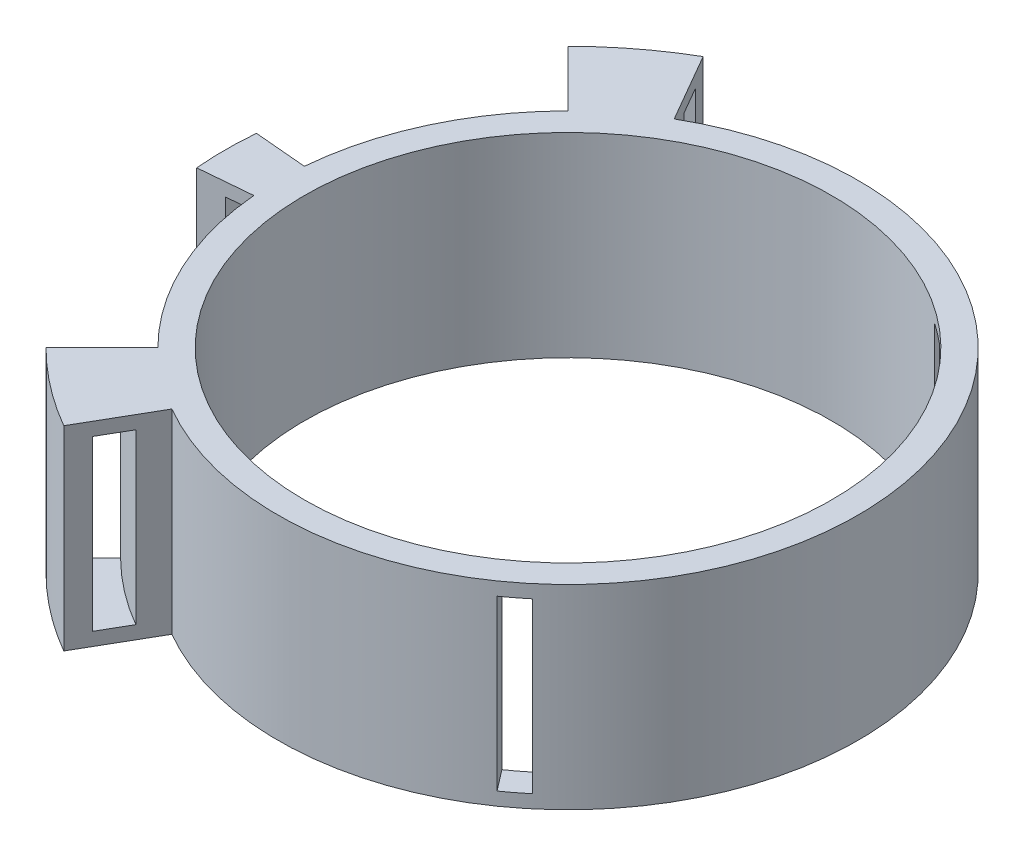
ISO-10303-21;
HEADER;
FILE_DESCRIPTION(('STEP AP214'),'2;1');
FILE_NAME('part.step','',(''),(''),'','','');
FILE_SCHEMA(('AUTOMOTIVE_DESIGN { 1 0 10303 214 1 1 1 1 }'));
ENDSEC;
DATA;
#1=APPLICATION_CONTEXT('core data for automotive mechanical design processes');
#2=APPLICATION_PROTOCOL_DEFINITION('international standard','automotive_design',2000,#1);
#3=PRODUCT_CONTEXT('',#1,'mechanical');
#4=PRODUCT('Part','Part','',(#3));
#5=PRODUCT_RELATED_PRODUCT_CATEGORY('part','',(#4));
#6=PRODUCT_DEFINITION_FORMATION('','',#4);
#7=PRODUCT_DEFINITION_CONTEXT('part definition',#1,'design');
#8=PRODUCT_DEFINITION('design','',#6,#7);
#9=PRODUCT_DEFINITION_SHAPE('','',#8);
#10=(LENGTH_UNIT() NAMED_UNIT(*) SI_UNIT(.MILLI.,.METRE.));
#11=(NAMED_UNIT(*) PLANE_ANGLE_UNIT() SI_UNIT($,.RADIAN.));
#12=(NAMED_UNIT(*) SI_UNIT($,.STERADIAN.) SOLID_ANGLE_UNIT());
#13=UNCERTAINTY_MEASURE_WITH_UNIT(LENGTH_MEASURE(1.E-05),#10,'distance_accuracy_value','');
#14=(GEOMETRIC_REPRESENTATION_CONTEXT(3) GLOBAL_UNCERTAINTY_ASSIGNED_CONTEXT((#13)) GLOBAL_UNIT_ASSIGNED_CONTEXT((#10,
#11,#12)) REPRESENTATION_CONTEXT('',''));
#15=CARTESIAN_POINT('',(0.,0.,0.));
#16=DIRECTION('',(0.,0.,1.));
#17=DIRECTION('',(1.,0.,0.));
#18=AXIS2_PLACEMENT_3D('',#15,#16,#17);
#19=CARTESIAN_POINT('',(0.,0.5,0.));
#20=DIRECTION('',(0.,-1.,0.));
#21=DIRECTION('',(0.,0.,-1.));
#22=AXIS2_PLACEMENT_3D('',#19,#20,#21);
#23=CYLINDRICAL_SURFACE('',#22,11.);
#24=CARTESIAN_POINT('',(0.,7.4,0.));
#25=DIRECTION('',(0.,1.,0.));
#26=DIRECTION('',(0.,0.,1.));
#27=AXIS2_PLACEMENT_3D('',#24,#25,#26);
#28=CIRCLE('',#27,11.);
#29=CARTESIAN_POINT('',(-7.77817459305193,7.4,-7.77817459305211));
#30=VERTEX_POINT('',#29);
#31=CARTESIAN_POINT('',(-10.9581416790092,7.4,-0.958713170224183));
#32=VERTEX_POINT('',#31);
#33=EDGE_CURVE('E380',#30,#32,#28,.T.);
#34=ORIENTED_EDGE('',*,*,#33,.F.);
#35=DIRECTION('',(0.,-1.,0.));
#36=VECTOR('',#35,1.);
#37=CARTESIAN_POINT('',(-7.77817459305202,0.5,-7.77817459305202));
#38=LINE('',#37,#36);
#39=CARTESIAN_POINT('',(-7.77817459305202,0.,-7.77817459305202));
#40=VERTEX_POINT('',#39);
#41=EDGE_CURVE('E53',#30,#40,#38,.T.);
#42=ORIENTED_EDGE('',*,*,#41,.T.);
#43=CARTESIAN_POINT('',(0.,0.,0.));
#44=DIRECTION('',(0.,1.,0.));
#45=DIRECTION('',(0.,0.,1.));
#46=AXIS2_PLACEMENT_3D('',#43,#44,#45);
#47=CIRCLE('',#46,11.);
#48=CARTESIAN_POINT('',(-10.9581416790092,0.,-0.958713170224182));
#49=VERTEX_POINT('',#48);
#50=EDGE_CURVE('E478',#40,#49,#47,.T.);
#51=ORIENTED_EDGE('',*,*,#50,.T.);
#52=DIRECTION('',(0.,-1.,0.));
#53=VECTOR('',#52,1.);
#54=CARTESIAN_POINT('',(-10.9581416790092,0.5,-0.958713170224182));
#55=LINE('',#54,#53);
#56=CARTESIAN_POINT('',(-10.9581416790092,0.5,-0.958713170224182));
#57=VERTEX_POINT('',#56);
#58=EDGE_CURVE('E503',#57,#49,#55,.T.);
#59=ORIENTED_EDGE('',*,*,#58,.F.);
#60=CARTESIAN_POINT('',(0.,0.5,0.));
#61=DIRECTION('',(0.,1.,0.));
#62=DIRECTION('',(0.,0.,1.));
#63=AXIS2_PLACEMENT_3D('',#60,#61,#62);
#64=CIRCLE('',#63,11.);
#65=CARTESIAN_POINT('',(-10.9581416790092,0.5,0.958713170224146));
#66=VERTEX_POINT('',#65);
#67=EDGE_CURVE('E403',#57,#66,#64,.T.);
#68=ORIENTED_EDGE('',*,*,#67,.T.);
#69=DIRECTION('',(0.,-1.,0.));
#70=VECTOR('',#69,1.);
#71=CARTESIAN_POINT('',(-10.9581416790092,0.5,0.958713170224146));
#72=LINE('',#71,#70);
#73=CARTESIAN_POINT('',(-10.9581416790092,0.,0.958713170224146));
#74=VERTEX_POINT('',#73);
#75=EDGE_CURVE('E494',#66,#74,#72,.T.);
#76=ORIENTED_EDGE('',*,*,#75,.T.);
#77=CARTESIAN_POINT('',(0.,0.,0.));
#78=DIRECTION('',(0.,1.,0.));
#79=DIRECTION('',(0.,0.,1.));
#80=AXIS2_PLACEMENT_3D('',#77,#78,#79);
#81=CIRCLE('',#80,11.);
#82=CARTESIAN_POINT('',(-7.77817459305202,0.,7.77817459305202));
#83=VERTEX_POINT('',#82);
#84=EDGE_CURVE('E486',#74,#83,#81,.T.);
#85=ORIENTED_EDGE('',*,*,#84,.T.);
#86=DIRECTION('',(0.,-1.,0.));
#87=VECTOR('',#86,1.);
#88=CARTESIAN_POINT('',(-7.77817459305202,0.5,7.77817459305202));
#89=LINE('',#88,#87);
#90=CARTESIAN_POINT('',(-7.77817459305202,7.4,7.77817459305202));
#91=VERTEX_POINT('',#90);
#92=EDGE_CURVE('E491',#91,#83,#89,.T.);
#93=ORIENTED_EDGE('',*,*,#92,.F.);
#94=CARTESIAN_POINT('',(-10.9581416790092,7.4,0.958713170224137));
#95=VERTEX_POINT('',#94);
#96=EDGE_CURVE('E382',#95,#91,#28,.T.);
#97=ORIENTED_EDGE('',*,*,#96,.F.);
#98=DIRECTION('',(0.,-1.,0.));
#99=VECTOR('',#98,1.);
#100=CARTESIAN_POINT('',(-10.9581416790092,7.4,0.958713170224138));
#101=LINE('',#100,#99);
#102=CARTESIAN_POINT('',(-10.9581416790092,6.9,0.958713170224138));
#103=VERTEX_POINT('',#102);
#104=EDGE_CURVE('E313',#95,#103,#101,.T.);
#105=ORIENTED_EDGE('',*,*,#104,.T.);
#106=CARTESIAN_POINT('',(4.64742302777507E-13,6.9,0.));
#107=DIRECTION('',(0.,-1.,0.));
#108=DIRECTION('',(0.,0.,1.));
#109=AXIS2_PLACEMENT_3D('',#106,#107,#108);
#110=CIRCLE('',#109,11.0000000000005);
#111=CARTESIAN_POINT('',(-10.9581416790092,6.9,-0.958713170224183));
#112=VERTEX_POINT('',#111);
#113=EDGE_CURVE('E307',#103,#112,#110,.T.);
#114=ORIENTED_EDGE('',*,*,#113,.T.);
#115=DIRECTION('',(0.,-1.,0.));
#116=VECTOR('',#115,1.);
#117=CARTESIAN_POINT('',(-10.9581416790092,7.4,-0.958713170224183));
#118=LINE('',#117,#116);
#119=EDGE_CURVE('E305',#32,#112,#118,.T.);
#120=ORIENTED_EDGE('',*,*,#119,.F.);
#121=EDGE_LOOP('',(#34,#42,#51,#59,#68,#76,#85,#93,#97,#105,#114,#120));
#122=FACE_BOUND('',#121,.T.);
#123=ADVANCED_FACE('F38',(#122),#23,.T.);
#124=CARTESIAN_POINT('',(0.,6.9,0.));
#125=DIRECTION('',(0.,1.,0.));
#126=DIRECTION('',(0.,0.,1.));
#127=AXIS2_PLACEMENT_3D('',#124,#125,#126);
#128=CIRCLE('',#127,11.);
#129=CARTESIAN_POINT('',(7.0286952029722,6.9,-8.4615272701632));
#130=VERTEX_POINT('',#129);
#131=CARTESIAN_POINT('',(6.26875351227377,6.9,-9.03895621199457));
#132=VERTEX_POINT('',#131);
#133=EDGE_CURVE('E381',#130,#132,#128,.T.);
#134=ORIENTED_EDGE('',*,*,#133,.T.);
#135=DIRECTION('',(0.,-1.,0.));
#136=VECTOR('',#135,1.);
#137=CARTESIAN_POINT('',(6.26875351227377,6.9,-9.03895621199457));
#138=LINE('',#137,#136);
#139=CARTESIAN_POINT('',(6.26875351227377,0.5,-9.03895621199457));
#140=VERTEX_POINT('',#139);
#141=EDGE_CURVE('E411',#132,#140,#138,.T.);
#142=ORIENTED_EDGE('',*,*,#141,.T.);
#143=CARTESIAN_POINT('',(0.,0.5,0.));
#144=DIRECTION('',(0.,1.,0.));
#145=DIRECTION('',(0.,0.,1.));
#146=AXIS2_PLACEMENT_3D('',#143,#144,#145);
#147=CIRCLE('',#146,11.);
#148=CARTESIAN_POINT('',(7.0286952029722,0.5,-8.4615272701632));
#149=VERTEX_POINT('',#148);
#150=EDGE_CURVE('E450',#149,#140,#147,.T.);
#151=ORIENTED_EDGE('',*,*,#150,.F.);
#152=DIRECTION('',(0.,-1.,0.));
#153=VECTOR('',#152,1.);
#154=CARTESIAN_POINT('',(7.0286952029722,6.9,-8.4615272701632));
#155=LINE('',#154,#153);
#156=EDGE_CURVE('E400',#130,#149,#155,.T.);
#157=ORIENTED_EDGE('',*,*,#156,.F.);
#158=EDGE_LOOP('',(#134,#142,#151,#157));
#159=FACE_BOUND('',#158,.T.);
#160=DIRECTION('',(0.,-1.,0.));
#161=VECTOR('',#160,1.);
#162=CARTESIAN_POINT('',(6.31448772565599,6.9,9.00706637937902));
#163=LINE('',#162,#161);
#164=CARTESIAN_POINT('',(6.31448772565599,6.9,9.00706637937902));
#165=VERTEX_POINT('',#164);
#166=CARTESIAN_POINT('',(6.31448772565599,0.5,9.00706637937902));
#167=VERTEX_POINT('',#166);
#168=EDGE_CURVE('E427',#165,#167,#163,.T.);
#169=ORIENTED_EDGE('',*,*,#168,.F.);
#170=CARTESIAN_POINT('',(7.07066370655192,6.9,8.42648887430877));
#171=VERTEX_POINT('',#170);
#172=EDGE_CURVE('E389',#165,#171,#128,.T.);
#173=ORIENTED_EDGE('',*,*,#172,.T.);
#174=DIRECTION('',(0.,-1.,0.));
#175=VECTOR('',#174,1.);
#176=CARTESIAN_POINT('',(7.07066370655192,6.9,8.42648887430877));
#177=LINE('',#176,#175);
#178=CARTESIAN_POINT('',(7.07066370655192,0.5,8.42648887430877));
#179=VERTEX_POINT('',#178);
#180=EDGE_CURVE('E438',#171,#179,#177,.T.);
#181=ORIENTED_EDGE('',*,*,#180,.T.);
#182=CARTESIAN_POINT('',(0.,0.5,0.));
#183=DIRECTION('',(0.,1.,0.));
#184=DIRECTION('',(0.,0.,1.));
#185=AXIS2_PLACEMENT_3D('',#182,#183,#184);
#186=CIRCLE('',#185,11.);
#187=EDGE_CURVE('E444',#167,#179,#186,.T.);
#188=ORIENTED_EDGE('',*,*,#187,.F.);
#189=EDGE_LOOP('',(#169,#173,#181,#188));
#190=FACE_BOUND('',#189,.T.);
#191=DIRECTION('',(0.,-1.,0.));
#192=VECTOR('',#191,1.);
#193=CARTESIAN_POINT('',(-5.5,0.5,-9.52627944162883));
#194=LINE('',#193,#192);
#195=CARTESIAN_POINT('',(-5.50000000000003,7.4,-9.52627944162881));
#196=VERTEX_POINT('',#195);
#197=CARTESIAN_POINT('',(-5.5,0.,-9.52627944162883));
#198=VERTEX_POINT('',#197);
#199=EDGE_CURVE('E61',#196,#198,#194,.T.);
#200=ORIENTED_EDGE('',*,*,#199,.F.);
#201=CARTESIAN_POINT('',(-5.5,7.4,9.52627944162883));
#202=VERTEX_POINT('',#201);
#203=EDGE_CURVE('E385',#202,#196,#28,.T.);
#204=ORIENTED_EDGE('',*,*,#203,.F.);
#205=DIRECTION('',(0.,-1.,0.));
#206=VECTOR('',#205,1.);
#207=CARTESIAN_POINT('',(-5.5,0.5,9.52627944162882));
#208=LINE('',#207,#206);
#209=CARTESIAN_POINT('',(-5.5,0.,9.52627944162882));
#210=VERTEX_POINT('',#209);
#211=EDGE_CURVE('E46',#202,#210,#208,.T.);
#212=ORIENTED_EDGE('',*,*,#211,.T.);
#213=CARTESIAN_POINT('',(0.,0.,0.));
#214=DIRECTION('',(0.,1.,0.));
#215=DIRECTION('',(0.,0.,1.));
#216=AXIS2_PLACEMENT_3D('',#213,#214,#215);
#217=CIRCLE('',#216,11.);
#218=EDGE_CURVE('E471',#210,#198,#217,.T.);
#219=ORIENTED_EDGE('',*,*,#218,.T.);
#220=EDGE_LOOP('',(#200,#204,#212,#219));
#221=FACE_BOUND('',#220,.T.);
#222=ADVANCED_FACE('F509',(#159,#190,#221),#23,.T.);
#223=CARTESIAN_POINT('',(0.,0.5,0.));
#224=DIRECTION('',(0.,1.,0.));
#225=DIRECTION('',(0.,0.,1.));
#226=AXIS2_PLACEMENT_3D('',#223,#224,#225);
#227=PLANE('',#226);
#228=DIRECTION('',(-0.996194698091746,0.,-0.0871557427476526));
#229=VECTOR('',#228,1.);
#230=CARTESIAN_POINT('',(-10.9581416790092,0.5,-0.958713170224179));
#231=LINE('',#230,#229);
#232=CARTESIAN_POINT('',(-11.954336377101,0.5,-1.04586891297183));
#233=VERTEX_POINT('',#232);
#234=EDGE_CURVE('E456',#57,#233,#231,.T.);
#235=ORIENTED_EDGE('',*,*,#234,.T.);
#236=CARTESIAN_POINT('',(3.10463662404808E-13,0.5,0.));
#237=DIRECTION('',(0.,-1.,0.));
#238=DIRECTION('',(0.,0.,1.));
#239=AXIS2_PLACEMENT_3D('',#236,#237,#238);
#240=CIRCLE('',#239,12.0000000000003);
#241=CARTESIAN_POINT('',(-11.954336377101,0.5,1.04586891297179));
#242=VERTEX_POINT('',#241);
#243=EDGE_CURVE('E316',#242,#233,#240,.T.);
#244=ORIENTED_EDGE('',*,*,#243,.F.);
#245=DIRECTION('',(0.996194698091746,0.,-0.0871557427476497));
#246=VECTOR('',#245,1.);
#247=CARTESIAN_POINT('',(-10.9581416790092,0.5,0.958713170224146));
#248=LINE('',#247,#246);
#249=EDGE_CURVE('E458',#242,#66,#248,.T.);
#250=ORIENTED_EDGE('',*,*,#249,.T.);
#251=ORIENTED_EDGE('',*,*,#67,.F.);
#252=EDGE_LOOP('',(#235,#244,#250,#251));
#253=FACE_BOUND('',#252,.T.);
#254=ADVANCED_FACE('F558',(#253),#227,.T.);
#255=DIRECTION('',(0.707106781186548,0.,0.707106781186548));
#256=VECTOR('',#255,1.);
#257=CARTESIAN_POINT('',(-7.77817459305202,0.5,-7.77817459305202));
#258=LINE('',#257,#256);
#259=CARTESIAN_POINT('',(-9.33380951166242,0.5,-9.3338095116626));
#260=VERTEX_POINT('',#259);
#261=CARTESIAN_POINT('',(-8.48528137423857,0.5,-8.48528137423857));
#262=VERTEX_POINT('',#261);
#263=EDGE_CURVE('E454',#260,#262,#258,.T.);
#264=ORIENTED_EDGE('',*,*,#263,.T.);
#265=CARTESIAN_POINT('',(0.,0.5,0.));
#266=DIRECTION('',(0.,1.,0.));
#267=DIRECTION('',(0.,0.,-1.));
#268=AXIS2_PLACEMENT_3D('',#265,#266,#267);
#269=CIRCLE('',#268,12.0000000000001);
#270=CARTESIAN_POINT('',(-6.00000000000011,0.5,-10.3923048454134));
#271=VERTEX_POINT('',#270);
#272=EDGE_CURVE('E328',#271,#262,#269,.T.);
#273=ORIENTED_EDGE('',*,*,#272,.F.);
#274=DIRECTION('',(-0.5,0.,-0.866025403784439));
#275=VECTOR('',#274,1.);
#276=CARTESIAN_POINT('',(-5.5,0.5,-9.52627944162882));
#277=LINE('',#276,#275);
#278=CARTESIAN_POINT('',(-6.60000000000001,0.5,-11.4315353299546));
#279=VERTEX_POINT('',#278);
#280=EDGE_CURVE('E452',#271,#279,#277,.T.);
#281=ORIENTED_EDGE('',*,*,#280,.T.);
#282=CARTESIAN_POINT('',(0.,0.5,0.));
#283=DIRECTION('',(0.,-1.,0.));
#284=DIRECTION('',(0.,0.,-1.));
#285=AXIS2_PLACEMENT_3D('',#282,#283,#284);
#286=CIRCLE('',#285,13.2000000000001);
#287=EDGE_CURVE('E340',#260,#279,#286,.T.);
#288=ORIENTED_EDGE('',*,*,#287,.F.);
#289=EDGE_LOOP('',(#264,#273,#281,#288));
#290=FACE_BOUND('',#289,.T.);
#291=ADVANCED_FACE('F537',(#290),#227,.T.);
#292=DIRECTION('',(-0.707106781186548,0.,0.707106781186548));
#293=VECTOR('',#292,1.);
#294=CARTESIAN_POINT('',(-7.77817459305202,0.5,7.77817459305202));
#295=LINE('',#294,#293);
#296=CARTESIAN_POINT('',(-8.48528137423857,0.5,8.48528137423857));
#297=VERTEX_POINT('',#296);
#298=CARTESIAN_POINT('',(-9.33380951166243,0.5,9.33380951166243));
#299=VERTEX_POINT('',#298);
#300=EDGE_CURVE('E460',#297,#299,#295,.T.);
#301=ORIENTED_EDGE('',*,*,#300,.T.);
#302=CARTESIAN_POINT('',(0.,0.5,0.));
#303=DIRECTION('',(0.,-1.,0.));
#304=DIRECTION('',(0.,0.,1.));
#305=AXIS2_PLACEMENT_3D('',#302,#303,#304);
#306=CIRCLE('',#305,13.2000000000001);
#307=CARTESIAN_POINT('',(-6.60000000000001,0.5,11.4315353299546));
#308=VERTEX_POINT('',#307);
#309=EDGE_CURVE('E352',#308,#299,#306,.T.);
#310=ORIENTED_EDGE('',*,*,#309,.F.);
#311=DIRECTION('',(0.5,0.,-0.866025403784439));
#312=VECTOR('',#311,1.);
#313=CARTESIAN_POINT('',(-5.5,0.5,9.52627944162882));
#314=LINE('',#313,#312);
#315=CARTESIAN_POINT('',(-6.,0.5,10.3923048454133));
#316=VERTEX_POINT('',#315);
#317=EDGE_CURVE('E442',#308,#316,#314,.T.);
#318=ORIENTED_EDGE('',*,*,#317,.T.);
#319=CARTESIAN_POINT('',(0.,0.5,0.));
#320=DIRECTION('',(0.,1.,0.));
#321=DIRECTION('',(0.,0.,1.));
#322=AXIS2_PLACEMENT_3D('',#319,#320,#321);
#323=CIRCLE('',#322,12.0000000000001);
#324=EDGE_CURVE('E364',#297,#316,#323,.T.);
#325=ORIENTED_EDGE('',*,*,#324,.F.);
#326=EDGE_LOOP('',(#301,#310,#318,#325));
#327=FACE_BOUND('',#326,.T.);
#328=ADVANCED_FACE('F593',(#327),#227,.T.);
#329=CARTESIAN_POINT('',(0.,0.5,0.));
#330=DIRECTION('',(0.,-1.,0.));
#331=DIRECTION('',(0.,0.,1.));
#332=AXIS2_PLACEMENT_3D('',#329,#330,#331);
#333=CIRCLE('',#332,10.);
#334=CARTESIAN_POINT('',(5.66312717889455,0.5,-8.24190454662427));
#335=VERTEX_POINT('',#334);
#336=CARTESIAN_POINT('',(6.38972291179291,0.5,-7.69229751833018));
#337=VERTEX_POINT('',#336);
#338=EDGE_CURVE('E447',#335,#337,#333,.T.);
#339=ORIENTED_EDGE('',*,*,#338,.T.);
#340=DIRECTION('',(-0.638972291179291,0.,0.769229751833018));
#341=VECTOR('',#340,1.);
#342=CARTESIAN_POINT('',(0.,0.5,0.));
#343=LINE('',#342,#341);
#344=EDGE_CURVE('E384',#149,#337,#343,.T.);
#345=ORIENTED_EDGE('',*,*,#344,.F.);
#346=ORIENTED_EDGE('',*,*,#150,.T.);
#347=DIRECTION('',(0.604999089059934,0.,-0.79622616274313));
#348=VECTOR('',#347,1.);
#349=CARTESIAN_POINT('',(-0.379970845349219,0.5,-0.288714470915687));
#350=LINE('',#349,#348);
#351=EDGE_CURVE('E408',#335,#140,#350,.T.);
#352=ORIENTED_EDGE('',*,*,#351,.F.);
#353=EDGE_LOOP('',(#339,#345,#346,#352));
#354=FACE_BOUND('',#353,.T.);
#355=ADVANCED_FACE('F590',(#354),#227,.T.);
#356=CARTESIAN_POINT('',(6.42787609686538,0.5,7.66044443118979));
#357=VERTEX_POINT('',#356);
#358=CARTESIAN_POINT('',(5.7048697454489,0.5,8.21306649111413));
#359=VERTEX_POINT('',#358);
#360=EDGE_CURVE('E448',#357,#359,#333,.T.);
#361=ORIENTED_EDGE('',*,*,#360,.T.);
#362=DIRECTION('',(-0.608988032530656,0.,-0.79317940986541));
#363=VECTOR('',#362,1.);
#364=CARTESIAN_POINT('',(-0.378087990447965,0.5,0.290288752535124));
#365=LINE('',#364,#363);
#366=EDGE_CURVE('E414',#167,#359,#365,.T.);
#367=ORIENTED_EDGE('',*,*,#366,.F.);
#368=ORIENTED_EDGE('',*,*,#187,.T.);
#369=DIRECTION('',(-0.642787609686538,0.,-0.766044443118979));
#370=VECTOR('',#369,1.);
#371=CARTESIAN_POINT('',(0.,0.5,0.));
#372=LINE('',#371,#370);
#373=EDGE_CURVE('E430',#179,#357,#372,.T.);
#374=ORIENTED_EDGE('',*,*,#373,.T.);
#375=EDGE_LOOP('',(#361,#367,#368,#374));
#376=FACE_BOUND('',#375,.T.);
#377=ADVANCED_FACE('F585',(#376),#227,.T.);
#378=CARTESIAN_POINT('',(0.,0.5,0.));
#379=DIRECTION('',(0.,-1.,0.));
#380=DIRECTION('',(0.,0.,-1.));
#381=AXIS2_PLACEMENT_3D('',#378,#379,#380);
#382=CYLINDRICAL_SURFACE('',#381,14.);
#383=CARTESIAN_POINT('',(0.,0.,0.));
#384=DIRECTION('',(0.,1.,0.));
#385=DIRECTION('',(0.,0.,1.));
#386=AXIS2_PLACEMENT_3D('',#383,#384,#385);
#387=CIRCLE('',#386,14.);
#388=CARTESIAN_POINT('',(-9.89949493661166,0.,9.89949493661166));
#389=VERTEX_POINT('',#388);
#390=CARTESIAN_POINT('',(-7.,0.,12.1243556529821));
#391=VERTEX_POINT('',#390);
#392=EDGE_CURVE('E441',#389,#391,#387,.T.);
#393=ORIENTED_EDGE('',*,*,#392,.T.);
#394=DIRECTION('',(0.,-1.,0.));
#395=VECTOR('',#394,1.);
#396=CARTESIAN_POINT('',(-7.,0.5,12.1243556529821));
#397=LINE('',#396,#395);
#398=CARTESIAN_POINT('',(-7.,7.4,12.1243556529821));
#399=VERTEX_POINT('',#398);
#400=EDGE_CURVE('E11',#399,#391,#397,.T.);
#401=ORIENTED_EDGE('',*,*,#400,.F.);
#402=CARTESIAN_POINT('',(1.31838984174237E-13,7.4,-1.28369537222284E-13));
#403=DIRECTION('',(0.,1.,0.));
#404=DIRECTION('',(0.,0.,1.));
#405=AXIS2_PLACEMENT_3D('',#402,#403,#404);
#406=CIRCLE('',#405,14.0000000000002);
#407=CARTESIAN_POINT('',(-9.89949493661166,7.4,9.89949493661166));
#408=VERTEX_POINT('',#407);
#409=EDGE_CURVE('E280',#408,#399,#406,.T.);
#410=ORIENTED_EDGE('',*,*,#409,.F.);
#411=DIRECTION('',(0.,-1.,0.));
#412=VECTOR('',#411,1.);
#413=CARTESIAN_POINT('',(-9.89949493661166,0.5,9.89949493661166));
#414=LINE('',#413,#412);
#415=EDGE_CURVE('E462',#408,#389,#414,.T.);
#416=ORIENTED_EDGE('',*,*,#415,.T.);
#417=EDGE_LOOP('',(#393,#401,#410,#416));
#418=FACE_BOUND('',#417,.T.);
#419=ADVANCED_FACE('F40',(#418),#382,.T.);
#420=CARTESIAN_POINT('',(-5.5,0.5,9.52627944162882));
#421=DIRECTION('',(-0.866025403784439,0.,-0.5));
#422=DIRECTION('',(-0.5,0.,0.866025403784439));
#423=AXIS2_PLACEMENT_3D('',#420,#421,#422);
#424=PLANE('',#423);
#425=ORIENTED_EDGE('',*,*,#211,.F.);
#426=DIRECTION('',(0.5,0.,-0.866025403784439));
#427=VECTOR('',#426,1.);
#428=CARTESIAN_POINT('',(-7.,7.4,12.1243556529821));
#429=LINE('',#428,#427);
#430=EDGE_CURVE('E283',#399,#202,#429,.T.);
#431=ORIENTED_EDGE('',*,*,#430,.F.);
#432=ORIENTED_EDGE('',*,*,#400,.T.);
#433=DIRECTION('',(0.5,0.,-0.866025403784439));
#434=VECTOR('',#433,1.);
#435=CARTESIAN_POINT('',(-5.5,0.,9.52627944162882));
#436=LINE('',#435,#434);
#437=EDGE_CURVE('E465',#391,#210,#436,.T.);
#438=ORIENTED_EDGE('',*,*,#437,.T.);
#439=EDGE_LOOP('',(#425,#431,#432,#438));
#440=FACE_BOUND('',#439,.T.);
#441=DIRECTION('',(0.5,0.,-0.866025403784439));
#442=VECTOR('',#441,1.);
#443=CARTESIAN_POINT('',(-7.,6.9,12.1243556529821));
#444=LINE('',#443,#442);
#445=CARTESIAN_POINT('',(-6.60000000000001,6.9,11.4315353299546));
#446=VERTEX_POINT('',#445);
#447=CARTESIAN_POINT('',(-6.00000000000001,6.9,10.3923048454133));
#448=VERTEX_POINT('',#447);
#449=EDGE_CURVE('E277',#446,#448,#444,.T.);
#450=ORIENTED_EDGE('',*,*,#449,.T.);
#451=DIRECTION('',(0.,-1.,0.));
#452=VECTOR('',#451,1.);
#453=CARTESIAN_POINT('',(-6.00000000000001,6.9,10.3923048454133));
#454=LINE('',#453,#452);
#455=EDGE_CURVE('E368',#448,#316,#454,.T.);
#456=ORIENTED_EDGE('',*,*,#455,.T.);
#457=ORIENTED_EDGE('',*,*,#317,.F.);
#458=DIRECTION('',(0.,-1.,0.));
#459=VECTOR('',#458,1.);
#460=CARTESIAN_POINT('',(-6.60000000000001,6.9,11.4315353299546));
#461=LINE('',#460,#459);
#462=EDGE_CURVE('E361',#446,#308,#461,.T.);
#463=ORIENTED_EDGE('',*,*,#462,.F.);
#464=EDGE_LOOP('',(#450,#456,#457,#463));
#465=FACE_BOUND('',#464,.T.);
#466=ADVANCED_FACE('F512',(#440,#465),#424,.F.);
#467=CARTESIAN_POINT('',(0.,0.5,0.));
#468=DIRECTION('',(0.,-1.,0.));
#469=DIRECTION('',(0.,0.,-1.));
#470=AXIS2_PLACEMENT_3D('',#467,#468,#469);
#471=CYLINDRICAL_SURFACE('',#470,10.);
#472=CARTESIAN_POINT('',(0.,0.,0.));
#473=DIRECTION('',(0.,-1.,0.));
#474=DIRECTION('',(0.,0.,1.));
#475=AXIS2_PLACEMENT_3D('',#472,#473,#474);
#476=CIRCLE('',#475,10.);
#477=CARTESIAN_POINT('',(0.,0.,10.));
#478=VERTEX_POINT('',#477);
#479=EDGE_CURVE('E468',#478,#478,#476,.T.);
#480=ORIENTED_EDGE('',*,*,#479,.T.);
#481=EDGE_LOOP('',(#480));
#482=FACE_BOUND('',#481,.T.);
#483=DIRECTION('',(0.,-1.,0.));
#484=VECTOR('',#483,1.);
#485=CARTESIAN_POINT('',(6.42787609686538,6.9,7.66044443118979));
#486=LINE('',#485,#484);
#487=CARTESIAN_POINT('',(6.42787609686538,6.9,7.66044443118979));
#488=VERTEX_POINT('',#487);
#489=EDGE_CURVE('E434',#488,#357,#486,.T.);
#490=ORIENTED_EDGE('',*,*,#489,.F.);
#491=CARTESIAN_POINT('',(0.,6.9,0.));
#492=DIRECTION('',(0.,-1.,0.));
#493=DIRECTION('',(0.,0.,1.));
#494=AXIS2_PLACEMENT_3D('',#491,#492,#493);
#495=CIRCLE('',#494,10.);
#496=CARTESIAN_POINT('',(5.7048697454489,6.9,8.21306649111413));
#497=VERTEX_POINT('',#496);
#498=EDGE_CURVE('E388',#488,#497,#495,.T.);
#499=ORIENTED_EDGE('',*,*,#498,.T.);
#500=DIRECTION('',(0.,-1.,0.));
#501=VECTOR('',#500,1.);
#502=CARTESIAN_POINT('',(5.7048697454489,6.9,8.21306649111413));
#503=LINE('',#502,#501);
#504=EDGE_CURVE('E424',#497,#359,#503,.T.);
#505=ORIENTED_EDGE('',*,*,#504,.T.);
#506=ORIENTED_EDGE('',*,*,#360,.F.);
#507=EDGE_LOOP('',(#490,#499,#505,#506));
#508=FACE_BOUND('',#507,.T.);
#509=DIRECTION('',(0.,-1.,0.));
#510=VECTOR('',#509,1.);
#511=CARTESIAN_POINT('',(5.66312717889455,6.9,-8.24190454662427));
#512=LINE('',#511,#510);
#513=CARTESIAN_POINT('',(5.66312717889455,6.9,-8.24190454662427));
#514=VERTEX_POINT('',#513);
#515=EDGE_CURVE('E421',#514,#335,#512,.T.);
#516=ORIENTED_EDGE('',*,*,#515,.F.);
#517=CARTESIAN_POINT('',(6.38972291179291,6.9,-7.69229751833018));
#518=VERTEX_POINT('',#517);
#519=EDGE_CURVE('E376',#514,#518,#495,.T.);
#520=ORIENTED_EDGE('',*,*,#519,.T.);
#521=DIRECTION('',(0.,-1.,0.));
#522=VECTOR('',#521,1.);
#523=CARTESIAN_POINT('',(6.38972291179291,6.9,-7.69229751833018));
#524=LINE('',#523,#522);
#525=EDGE_CURVE('E395',#518,#337,#524,.T.);
#526=ORIENTED_EDGE('',*,*,#525,.T.);
#527=ORIENTED_EDGE('',*,*,#338,.F.);
#528=EDGE_LOOP('',(#516,#520,#526,#527));
#529=FACE_BOUND('',#528,.T.);
#530=CARTESIAN_POINT('',(0.,7.4,0.));
#531=DIRECTION('',(0.,-1.,0.));
#532=DIRECTION('',(0.,0.,1.));
#533=AXIS2_PLACEMENT_3D('',#530,#531,#532);
#534=CIRCLE('',#533,10.);
#535=CARTESIAN_POINT('',(0.,7.4,10.));
#536=VERTEX_POINT('',#535);
#537=EDGE_CURVE('E377',#536,#536,#534,.T.);
#538=ORIENTED_EDGE('',*,*,#537,.F.);
#539=EDGE_LOOP('',(#538));
#540=FACE_BOUND('',#539,.T.);
#541=ADVANCED_FACE('F524',(#482,#508,#529,#540),#471,.F.);
#542=CARTESIAN_POINT('',(-5.5,0.5,-9.52627944162882));
#543=DIRECTION('',(-0.866025403784439,0.,0.5));
#544=DIRECTION('',(0.5,0.,0.866025403784439));
#545=AXIS2_PLACEMENT_3D('',#542,#543,#544);
#546=PLANE('',#545);
#547=DIRECTION('',(0.,-1.,0.));
#548=VECTOR('',#547,1.);
#549=CARTESIAN_POINT('',(-7.,0.5,-12.1243556529821));
#550=LINE('',#549,#548);
#551=CARTESIAN_POINT('',(-7.,7.4,-12.1243556529823));
#552=VERTEX_POINT('',#551);
#553=CARTESIAN_POINT('',(-7.,0.,-12.1243556529821));
#554=VERTEX_POINT('',#553);
#555=EDGE_CURVE('E257',#552,#554,#550,.T.);
#556=ORIENTED_EDGE('',*,*,#555,.F.);
#557=DIRECTION('',(-0.500000000000003,0.,-0.866025403784437));
#558=VECTOR('',#557,1.);
#559=CARTESIAN_POINT('',(-7.,7.4,-12.1243556529823));
#560=LINE('',#559,#558);
#561=EDGE_CURVE('E263',#196,#552,#560,.T.);
#562=ORIENTED_EDGE('',*,*,#561,.F.);
#563=ORIENTED_EDGE('',*,*,#199,.T.);
#564=DIRECTION('',(-0.5,0.,-0.866025403784439));
#565=VECTOR('',#564,1.);
#566=CARTESIAN_POINT('',(-5.5,0.,-9.52627944162882));
#567=LINE('',#566,#565);
#568=EDGE_CURVE('E473',#198,#554,#567,.T.);
#569=ORIENTED_EDGE('',*,*,#568,.T.);
#570=EDGE_LOOP('',(#556,#562,#563,#569));
#571=FACE_BOUND('',#570,.T.);
#572=DIRECTION('',(-0.500000000000003,0.,-0.866025403784437));
#573=VECTOR('',#572,1.);
#574=CARTESIAN_POINT('',(-7.,6.9,-12.1243556529823));
#575=LINE('',#574,#573);
#576=CARTESIAN_POINT('',(-5.99999999999998,6.9,-10.3923048454134));
#577=VERTEX_POINT('',#576);
#578=CARTESIAN_POINT('',(-6.60000000000001,6.9,-11.4315353299548));
#579=VERTEX_POINT('',#578);
#580=EDGE_CURVE('E270',#577,#579,#575,.T.);
#581=ORIENTED_EDGE('',*,*,#580,.T.);
#582=DIRECTION('',(0.,-1.,0.));
#583=VECTOR('',#582,1.);
#584=CARTESIAN_POINT('',(-6.60000000000001,6.9,-11.4315353299548));
#585=LINE('',#584,#583);
#586=EDGE_CURVE('E344',#579,#279,#585,.T.);
#587=ORIENTED_EDGE('',*,*,#586,.T.);
#588=ORIENTED_EDGE('',*,*,#280,.F.);
#589=DIRECTION('',(0.,-1.,0.));
#590=VECTOR('',#589,1.);
#591=CARTESIAN_POINT('',(-6.,6.9,-10.3923048454134));
#592=LINE('',#591,#590);
#593=EDGE_CURVE('E337',#577,#271,#592,.T.);
#594=ORIENTED_EDGE('',*,*,#593,.F.);
#595=EDGE_LOOP('',(#581,#587,#588,#594));
#596=FACE_BOUND('',#595,.T.);
#597=ADVANCED_FACE('F521',(#571,#596),#546,.F.);
#598=CARTESIAN_POINT('',(0.,0.5,0.));
#599=DIRECTION('',(0.,-1.,0.));
#600=DIRECTION('',(0.,0.,-1.));
#601=AXIS2_PLACEMENT_3D('',#598,#599,#600);
#602=CYLINDRICAL_SURFACE('',#601,14.);
#603=CARTESIAN_POINT('',(0.,0.,0.));
#604=DIRECTION('',(0.,1.,0.));
#605=DIRECTION('',(0.,0.,1.));
#606=AXIS2_PLACEMENT_3D('',#603,#604,#605);
#607=CIRCLE('',#606,14.);
#608=CARTESIAN_POINT('',(-9.89949493661166,0.,-9.89949493661167));
#609=VERTEX_POINT('',#608);
#610=EDGE_CURVE('E255',#554,#609,#607,.T.);
#611=ORIENTED_EDGE('',*,*,#610,.T.);
#612=DIRECTION('',(0.,-1.,0.));
#613=VECTOR('',#612,1.);
#614=CARTESIAN_POINT('',(-9.89949493661166,0.5,-9.89949493661167));
#615=LINE('',#614,#613);
#616=CARTESIAN_POINT('',(-9.89949493661167,7.4,-9.89949493661182));
#617=VERTEX_POINT('',#616);
#618=EDGE_CURVE('E249',#617,#609,#615,.T.);
#619=ORIENTED_EDGE('',*,*,#618,.F.);
#620=CARTESIAN_POINT('',(2.54136989230602E-13,7.4,1.90819582357449E-13));
#621=DIRECTION('',(0.,1.,0.));
#622=DIRECTION('',(0.,0.,1.));
#623=AXIS2_PLACEMENT_3D('',#620,#621,#622);
#624=CIRCLE('',#623,14.0000000000004);
#625=EDGE_CURVE('E253',#552,#617,#624,.T.);
#626=ORIENTED_EDGE('',*,*,#625,.F.);
#627=ORIENTED_EDGE('',*,*,#555,.T.);
#628=EDGE_LOOP('',(#611,#619,#626,#627));
#629=FACE_BOUND('',#628,.T.);
#630=ADVANCED_FACE('F250',(#629),#602,.T.);
#631=CARTESIAN_POINT('',(-7.77817459305202,0.5,-7.77817459305202));
#632=DIRECTION('',(0.707106781186547,0.,-0.707106781186547));
#633=DIRECTION('',(-0.707106781186548,0.,-0.707106781186548));
#634=AXIS2_PLACEMENT_3D('',#631,#632,#633);
#635=PLANE('',#634);
#636=DIRECTION('',(0.,-1.,0.));
#637=VECTOR('',#636,1.);
#638=CARTESIAN_POINT('',(-9.33380951166242,6.9,-9.3338095116626));
#639=LINE('',#638,#637);
#640=CARTESIAN_POINT('',(-9.33380951166242,6.9,-9.3338095116626));
#641=VERTEX_POINT('',#640);
#642=EDGE_CURVE('E349',#641,#260,#639,.T.);
#643=ORIENTED_EDGE('',*,*,#642,.F.);
#644=DIRECTION('',(0.707106781186551,0.,0.707106781186544));
#645=VECTOR('',#644,1.);
#646=CARTESIAN_POINT('',(-9.89949493661167,6.9,-9.89949493661182));
#647=LINE('',#646,#645);
#648=CARTESIAN_POINT('',(-8.48528137423857,6.9,-8.48528137423875));
#649=VERTEX_POINT('',#648);
#650=EDGE_CURVE('E273',#641,#649,#647,.T.);
#651=ORIENTED_EDGE('',*,*,#650,.T.);
#652=DIRECTION('',(0.,-1.,0.));
#653=VECTOR('',#652,1.);
#654=CARTESIAN_POINT('',(-8.48528137423857,6.9,-8.48528137423875));
#655=LINE('',#654,#653);
#656=EDGE_CURVE('E332',#649,#262,#655,.T.);
#657=ORIENTED_EDGE('',*,*,#656,.T.);
#658=ORIENTED_EDGE('',*,*,#263,.F.);
#659=EDGE_LOOP('',(#643,#651,#657,#658));
#660=FACE_BOUND('',#659,.T.);
#661=DIRECTION('',(0.707106781186548,0.,0.707106781186548));
#662=VECTOR('',#661,1.);
#663=CARTESIAN_POINT('',(-7.77817459305202,0.,-7.77817459305202));
#664=LINE('',#663,#662);
#665=EDGE_CURVE('E476',#609,#40,#664,.T.);
#666=ORIENTED_EDGE('',*,*,#665,.T.);
#667=ORIENTED_EDGE('',*,*,#41,.F.);
#668=DIRECTION('',(0.707106781186551,0.,0.707106781186544));
#669=VECTOR('',#668,1.);
#670=CARTESIAN_POINT('',(-9.89949493661167,7.4,-9.89949493661182));
#671=LINE('',#670,#669);
#672=EDGE_CURVE('E260',#617,#30,#671,.T.);
#673=ORIENTED_EDGE('',*,*,#672,.F.);
#674=ORIENTED_EDGE('',*,*,#618,.T.);
#675=EDGE_LOOP('',(#666,#667,#673,#674));
#676=FACE_BOUND('',#675,.T.);
#677=ADVANCED_FACE('F261',(#660,#676),#635,.F.);
#678=CARTESIAN_POINT('',(-10.9581416790092,0.5,-0.958713170224179));
#679=DIRECTION('',(-0.0871557427476526,0.,0.996194698091746));
#680=DIRECTION('',(0.996194698091746,0.,0.0871557427476526));
#681=AXIS2_PLACEMENT_3D('',#678,#679,#680);
#682=PLANE('',#681);
#683=DIRECTION('',(-0.996194698091746,0.,-0.0871557427476526));
#684=VECTOR('',#683,1.);
#685=CARTESIAN_POINT('',(-10.9581416790092,0.,-0.958713170224179));
#686=LINE('',#685,#684);
#687=CARTESIAN_POINT('',(-12.9505310751927,0.,-1.13302465571948));
#688=VERTEX_POINT('',#687);
#689=EDGE_CURVE('E480',#49,#688,#686,.T.);
#690=ORIENTED_EDGE('',*,*,#689,.T.);
#691=DIRECTION('',(0.,-1.,0.));
#692=VECTOR('',#691,1.);
#693=CARTESIAN_POINT('',(-12.9505310751927,0.5,-1.13302465571948));
#694=LINE('',#693,#692);
#695=CARTESIAN_POINT('',(-12.9505310751927,7.4,-1.13302465571948));
#696=VERTEX_POINT('',#695);
#697=EDGE_CURVE('E500',#696,#688,#694,.T.);
#698=ORIENTED_EDGE('',*,*,#697,.F.);
#699=DIRECTION('',(-0.996194698091746,0.,-0.0871557427476509));
#700=VECTOR('',#699,1.);
#701=CARTESIAN_POINT('',(-12.9505310751927,7.4,-1.13302465571948));
#702=LINE('',#701,#700);
#703=EDGE_CURVE('E302',#32,#696,#702,.T.);
#704=ORIENTED_EDGE('',*,*,#703,.F.);
#705=ORIENTED_EDGE('',*,*,#119,.T.);
#706=DIRECTION('',(-0.996194698091746,0.,-0.0871557427476509));
#707=VECTOR('',#706,1.);
#708=CARTESIAN_POINT('',(-12.9505310751927,6.9,-1.13302465571948));
#709=LINE('',#708,#707);
#710=CARTESIAN_POINT('',(-11.954336377101,6.9,-1.04586891297183));
#711=VERTEX_POINT('',#710);
#712=EDGE_CURVE('E299',#112,#711,#709,.T.);
#713=ORIENTED_EDGE('',*,*,#712,.T.);
#714=DIRECTION('',(0.,-1.,0.));
#715=VECTOR('',#714,1.);
#716=CARTESIAN_POINT('',(-11.954336377101,6.9,-1.04586891297183));
#717=LINE('',#716,#715);
#718=EDGE_CURVE('E320',#711,#233,#717,.T.);
#719=ORIENTED_EDGE('',*,*,#718,.T.);
#720=ORIENTED_EDGE('',*,*,#234,.F.);
#721=ORIENTED_EDGE('',*,*,#58,.T.);
#722=EDGE_LOOP('',(#690,#698,#704,#705,#713,#719,#720,#721));
#723=FACE_BOUND('',#722,.T.);
#724=ADVANCED_FACE('F542',(#723),#682,.F.);
#725=CARTESIAN_POINT('',(0.,0.5,0.));
#726=DIRECTION('',(0.,-1.,0.));
#727=DIRECTION('',(0.,0.,-1.));
#728=AXIS2_PLACEMENT_3D('',#725,#726,#727);
#729=CYLINDRICAL_SURFACE('',#728,13.);
#730=CARTESIAN_POINT('',(0.,0.,0.));
#731=DIRECTION('',(0.,1.,0.));
#732=DIRECTION('',(0.,0.,1.));
#733=AXIS2_PLACEMENT_3D('',#730,#731,#732);
#734=CIRCLE('',#733,13.);
#735=CARTESIAN_POINT('',(-12.9505310751927,0.,1.13302465571944));
#736=VERTEX_POINT('',#735);
#737=EDGE_CURVE('E482',#688,#736,#734,.T.);
#738=ORIENTED_EDGE('',*,*,#737,.T.);
#739=DIRECTION('',(0.,-1.,0.));
#740=VECTOR('',#739,1.);
#741=CARTESIAN_POINT('',(-12.9505310751927,0.5,1.13302465571944));
#742=LINE('',#741,#740);
#743=CARTESIAN_POINT('',(-12.9505310751927,7.4,1.13302465571944));
#744=VERTEX_POINT('',#743);
#745=EDGE_CURVE('E497',#744,#736,#742,.T.);
#746=ORIENTED_EDGE('',*,*,#745,.F.);
#747=CARTESIAN_POINT('',(1.76941794549634E-13,7.4,0.));
#748=DIRECTION('',(0.,1.,0.));
#749=DIRECTION('',(0.,0.,-1.));
#750=AXIS2_PLACEMENT_3D('',#747,#748,#749);
#751=CIRCLE('',#750,13.0000000000002);
#752=EDGE_CURVE('E295',#696,#744,#751,.T.);
#753=ORIENTED_EDGE('',*,*,#752,.F.);
#754=ORIENTED_EDGE('',*,*,#697,.T.);
#755=EDGE_LOOP('',(#738,#746,#753,#754));
#756=FACE_BOUND('',#755,.T.);
#757=ADVANCED_FACE('F548',(#756),#729,.T.);
#758=CARTESIAN_POINT('',(-10.9581416790092,0.5,0.958713170224146));
#759=DIRECTION('',(-0.0871557427476497,0.,-0.996194698091746));
#760=DIRECTION('',(-0.996194698091746,0.,0.0871557427476497));
#761=AXIS2_PLACEMENT_3D('',#758,#759,#760);
#762=PLANE('',#761);
#763=DIRECTION('',(0.996194698091746,0.,-0.0871557427476497));
#764=VECTOR('',#763,1.);
#765=CARTESIAN_POINT('',(-10.9581416790092,0.,0.958713170224146));
#766=LINE('',#765,#764);
#767=EDGE_CURVE('E484',#736,#74,#766,.T.);
#768=ORIENTED_EDGE('',*,*,#767,.T.);
#769=ORIENTED_EDGE('',*,*,#75,.F.);
#770=ORIENTED_EDGE('',*,*,#249,.F.);
#771=DIRECTION('',(0.,-1.,0.));
#772=VECTOR('',#771,1.);
#773=CARTESIAN_POINT('',(-11.954336377101,6.9,1.04586891297179));
#774=LINE('',#773,#772);
#775=CARTESIAN_POINT('',(-11.954336377101,6.9,1.04586891297179));
#776=VERTEX_POINT('',#775);
#777=EDGE_CURVE('E325',#776,#242,#774,.T.);
#778=ORIENTED_EDGE('',*,*,#777,.F.);
#779=DIRECTION('',(0.996194698091746,0.,-0.0871557427476475));
#780=VECTOR('',#779,1.);
#781=CARTESIAN_POINT('',(-12.9505310751927,6.9,1.13302465571944));
#782=LINE('',#781,#780);
#783=EDGE_CURVE('E290',#776,#103,#782,.T.);
#784=ORIENTED_EDGE('',*,*,#783,.T.);
#785=ORIENTED_EDGE('',*,*,#104,.F.);
#786=DIRECTION('',(0.996194698091746,0.,-0.0871557427476475));
#787=VECTOR('',#786,1.);
#788=CARTESIAN_POINT('',(-12.9505310751927,7.4,1.13302465571944));
#789=LINE('',#788,#787);
#790=EDGE_CURVE('E298',#744,#95,#789,.T.);
#791=ORIENTED_EDGE('',*,*,#790,.F.);
#792=ORIENTED_EDGE('',*,*,#745,.T.);
#793=EDGE_LOOP('',(#768,#769,#770,#778,#784,#785,#791,#792));
#794=FACE_BOUND('',#793,.T.);
#795=ADVANCED_FACE('F564',(#794),#762,.F.);
#796=CARTESIAN_POINT('',(-7.77817459305202,0.5,7.77817459305202));
#797=DIRECTION('',(0.707106781186547,0.,0.707106781186547));
#798=DIRECTION('',(0.707106781186548,0.,-0.707106781186548));
#799=AXIS2_PLACEMENT_3D('',#796,#797,#798);
#800=PLANE('',#799);
#801=DIRECTION('',(0.,-1.,0.));
#802=VECTOR('',#801,1.);
#803=CARTESIAN_POINT('',(-8.48528137423857,6.9,8.48528137423857));
#804=LINE('',#803,#802);
#805=CARTESIAN_POINT('',(-8.48528137423857,6.9,8.48528137423857));
#806=VERTEX_POINT('',#805);
#807=EDGE_CURVE('E373',#806,#297,#804,.T.);
#808=ORIENTED_EDGE('',*,*,#807,.F.);
#809=DIRECTION('',(-0.707106781186548,0.,0.707106781186548));
#810=VECTOR('',#809,1.);
#811=CARTESIAN_POINT('',(-9.89949493661166,6.9,9.89949493661166));
#812=LINE('',#811,#810);
#813=CARTESIAN_POINT('',(-9.33380951166242,6.9,9.33380951166243));
#814=VERTEX_POINT('',#813);
#815=EDGE_CURVE('E284',#806,#814,#812,.T.);
#816=ORIENTED_EDGE('',*,*,#815,.T.);
#817=DIRECTION('',(0.,-1.,0.));
#818=VECTOR('',#817,1.);
#819=CARTESIAN_POINT('',(-9.33380951166242,6.9,9.33380951166243));
#820=LINE('',#819,#818);
#821=EDGE_CURVE('E356',#814,#299,#820,.T.);
#822=ORIENTED_EDGE('',*,*,#821,.T.);
#823=ORIENTED_EDGE('',*,*,#300,.F.);
#824=EDGE_LOOP('',(#808,#816,#822,#823));
#825=FACE_BOUND('',#824,.T.);
#826=DIRECTION('',(-0.707106781186548,0.,0.707106781186548));
#827=VECTOR('',#826,1.);
#828=CARTESIAN_POINT('',(-7.77817459305202,0.,7.77817459305202));
#829=LINE('',#828,#827);
#830=EDGE_CURVE('E445',#83,#389,#829,.T.);
#831=ORIENTED_EDGE('',*,*,#830,.T.);
#832=ORIENTED_EDGE('',*,*,#415,.F.);
#833=DIRECTION('',(-0.707106781186548,0.,0.707106781186548));
#834=VECTOR('',#833,1.);
#835=CARTESIAN_POINT('',(-9.89949493661166,7.4,9.89949493661166));
#836=LINE('',#835,#834);
#837=EDGE_CURVE('E287',#91,#408,#836,.T.);
#838=ORIENTED_EDGE('',*,*,#837,.F.);
#839=ORIENTED_EDGE('',*,*,#92,.T.);
#840=EDGE_LOOP('',(#831,#832,#838,#839));
#841=FACE_BOUND('',#840,.T.);
#842=ADVANCED_FACE('F562',(#825,#841),#800,.F.);
#843=CARTESIAN_POINT('',(0.,0.,0.));
#844=DIRECTION('',(0.,1.,0.));
#845=DIRECTION('',(0.,0.,1.));
#846=AXIS2_PLACEMENT_3D('',#843,#844,#845);
#847=PLANE('',#846);
#848=ORIENTED_EDGE('',*,*,#218,.F.);
#849=ORIENTED_EDGE('',*,*,#437,.F.);
#850=ORIENTED_EDGE('',*,*,#392,.F.);
#851=ORIENTED_EDGE('',*,*,#830,.F.);
#852=ORIENTED_EDGE('',*,*,#84,.F.);
#853=ORIENTED_EDGE('',*,*,#767,.F.);
#854=ORIENTED_EDGE('',*,*,#737,.F.);
#855=ORIENTED_EDGE('',*,*,#689,.F.);
#856=ORIENTED_EDGE('',*,*,#50,.F.);
#857=ORIENTED_EDGE('',*,*,#665,.F.);
#858=ORIENTED_EDGE('',*,*,#610,.F.);
#859=ORIENTED_EDGE('',*,*,#568,.F.);
#860=EDGE_LOOP('',(#848,#849,#850,#851,#852,#853,#854,#855,#856,#857,#858,#859));
#861=FACE_BOUND('',#860,.T.);
#862=ORIENTED_EDGE('',*,*,#479,.F.);
#863=EDGE_LOOP('',(#862));
#864=FACE_BOUND('',#863,.T.);
#865=ADVANCED_FACE('F516',(#861,#864),#847,.F.);
#866=CARTESIAN_POINT('',(0.,6.9,0.));
#867=DIRECTION('',(-0.766044443118979,0.,0.642787609686538));
#868=DIRECTION('',(0.642787609686538,0.,0.766044443118979));
#869=AXIS2_PLACEMENT_3D('',#866,#867,#868);
#870=PLANE('',#869);
#871=ORIENTED_EDGE('',*,*,#373,.F.);
#872=ORIENTED_EDGE('',*,*,#180,.F.);
#873=DIRECTION('',(-0.642787609686538,0.,-0.766044443118979));
#874=VECTOR('',#873,1.);
#875=CARTESIAN_POINT('',(0.,6.9,0.));
#876=LINE('',#875,#874);
#877=EDGE_CURVE('E431',#171,#488,#876,.T.);
#878=ORIENTED_EDGE('',*,*,#877,.T.);
#879=ORIENTED_EDGE('',*,*,#489,.T.);
#880=EDGE_LOOP('',(#871,#872,#878,#879));
#881=FACE_BOUND('',#880,.T.);
#882=ADVANCED_FACE('F663',(#881),#870,.T.);
#883=CARTESIAN_POINT('',(-0.378087990447965,6.9,0.290288752535124));
#884=DIRECTION('',(-0.79317940986541,0.,0.608988032530656));
#885=DIRECTION('',(0.608988032530656,0.,0.79317940986541));
#886=AXIS2_PLACEMENT_3D('',#883,#884,#885);
#887=PLANE('',#886);
#888=ORIENTED_EDGE('',*,*,#366,.T.);
#889=ORIENTED_EDGE('',*,*,#504,.F.);
#890=DIRECTION('',(-0.608988032530656,0.,-0.79317940986541));
#891=VECTOR('',#890,1.);
#892=CARTESIAN_POINT('',(-0.378087990447965,6.9,0.290288752535124));
#893=LINE('',#892,#891);
#894=EDGE_CURVE('E404',#165,#497,#893,.T.);
#895=ORIENTED_EDGE('',*,*,#894,.F.);
#896=ORIENTED_EDGE('',*,*,#168,.T.);
#897=EDGE_LOOP('',(#888,#889,#895,#896));
#898=FACE_BOUND('',#897,.T.);
#899=ADVANCED_FACE('F660',(#898),#887,.F.);
#900=CARTESIAN_POINT('',(-0.379970845349219,6.9,-0.288714470915687));
#901=DIRECTION('',(-0.79622616274313,0.,-0.604999089059934));
#902=DIRECTION('',(-0.604999089059934,0.,0.79622616274313));
#903=AXIS2_PLACEMENT_3D('',#900,#901,#902);
#904=PLANE('',#903);
#905=ORIENTED_EDGE('',*,*,#351,.T.);
#906=ORIENTED_EDGE('',*,*,#141,.F.);
#907=DIRECTION('',(0.604999089059934,0.,-0.79622616274313));
#908=VECTOR('',#907,1.);
#909=CARTESIAN_POINT('',(-0.379970845349219,6.9,-0.288714470915687));
#910=LINE('',#909,#908);
#911=EDGE_CURVE('E407',#514,#132,#910,.T.);
#912=ORIENTED_EDGE('',*,*,#911,.F.);
#913=ORIENTED_EDGE('',*,*,#515,.T.);
#914=EDGE_LOOP('',(#905,#906,#912,#913));
#915=FACE_BOUND('',#914,.T.);
#916=ADVANCED_FACE('F656',(#915),#904,.F.);
#917=CARTESIAN_POINT('',(0.,6.9,0.));
#918=DIRECTION('',(0.769229751833018,0.,0.638972291179291));
#919=DIRECTION('',(0.638972291179291,0.,-0.769229751833018));
#920=AXIS2_PLACEMENT_3D('',#917,#918,#919);
#921=PLANE('',#920);
#922=ORIENTED_EDGE('',*,*,#344,.T.);
#923=ORIENTED_EDGE('',*,*,#525,.F.);
#924=DIRECTION('',(-0.638972291179291,0.,0.769229751833018));
#925=VECTOR('',#924,1.);
#926=CARTESIAN_POINT('',(0.,6.9,0.));
#927=LINE('',#926,#925);
#928=EDGE_CURVE('E392',#130,#518,#927,.T.);
#929=ORIENTED_EDGE('',*,*,#928,.F.);
#930=ORIENTED_EDGE('',*,*,#156,.T.);
#931=EDGE_LOOP('',(#922,#923,#929,#930));
#932=FACE_BOUND('',#931,.T.);
#933=ADVANCED_FACE('F652',(#932),#921,.F.);
#934=CARTESIAN_POINT('',(0.,6.9,0.));
#935=DIRECTION('',(0.,1.,0.));
#936=DIRECTION('',(0.,0.,1.));
#937=AXIS2_PLACEMENT_3D('',#934,#935,#936);
#938=PLANE('',#937);
#939=ORIENTED_EDGE('',*,*,#877,.F.);
#940=ORIENTED_EDGE('',*,*,#172,.F.);
#941=ORIENTED_EDGE('',*,*,#894,.T.);
#942=ORIENTED_EDGE('',*,*,#498,.F.);
#943=EDGE_LOOP('',(#939,#940,#941,#942));
#944=FACE_BOUND('',#943,.T.);
#945=ADVANCED_FACE('F649',(#944),#938,.F.);
#946=ORIENTED_EDGE('',*,*,#519,.F.);
#947=ORIENTED_EDGE('',*,*,#911,.T.);
#948=ORIENTED_EDGE('',*,*,#133,.F.);
#949=ORIENTED_EDGE('',*,*,#928,.T.);
#950=EDGE_LOOP('',(#946,#947,#948,#949));
#951=FACE_BOUND('',#950,.T.);
#952=ADVANCED_FACE('F648',(#951),#938,.F.);
#953=CARTESIAN_POINT('',(0.,7.4,0.));
#954=DIRECTION('',(0.,1.,0.));
#955=DIRECTION('',(0.,0.,1.));
#956=AXIS2_PLACEMENT_3D('',#953,#954,#955);
#957=PLANE('',#956);
#958=ORIENTED_EDGE('',*,*,#96,.T.);
#959=ORIENTED_EDGE('',*,*,#837,.T.);
#960=ORIENTED_EDGE('',*,*,#409,.T.);
#961=ORIENTED_EDGE('',*,*,#430,.T.);
#962=ORIENTED_EDGE('',*,*,#203,.T.);
#963=ORIENTED_EDGE('',*,*,#561,.T.);
#964=ORIENTED_EDGE('',*,*,#625,.T.);
#965=ORIENTED_EDGE('',*,*,#672,.T.);
#966=ORIENTED_EDGE('',*,*,#33,.T.);
#967=ORIENTED_EDGE('',*,*,#703,.T.);
#968=ORIENTED_EDGE('',*,*,#752,.T.);
#969=ORIENTED_EDGE('',*,*,#790,.T.);
#970=EDGE_LOOP('',(#958,#959,#960,#961,#962,#963,#964,#965,#966,#967,#968,#969));
#971=FACE_BOUND('',#970,.T.);
#972=ORIENTED_EDGE('',*,*,#537,.T.);
#973=EDGE_LOOP('',(#972));
#974=FACE_BOUND('',#973,.T.);
#975=ADVANCED_FACE('F267',(#971,#974),#957,.T.);
#976=CARTESIAN_POINT('',(0.,6.9,0.));
#977=DIRECTION('',(0.,-1.,0.));
#978=DIRECTION('',(0.,0.,-1.));
#979=AXIS2_PLACEMENT_3D('',#976,#977,#978);
#980=CYLINDRICAL_SURFACE('',#979,12.0000000000001);
#981=ORIENTED_EDGE('',*,*,#324,.T.);
#982=ORIENTED_EDGE('',*,*,#455,.F.);
#983=CARTESIAN_POINT('',(0.,6.9,0.));
#984=DIRECTION('',(0.,1.,0.));
#985=DIRECTION('',(0.,0.,1.));
#986=AXIS2_PLACEMENT_3D('',#983,#984,#985);
#987=CIRCLE('',#986,12.0000000000001);
#988=EDGE_CURVE('E365',#806,#448,#987,.T.);
#989=ORIENTED_EDGE('',*,*,#988,.F.);
#990=ORIENTED_EDGE('',*,*,#807,.T.);
#991=EDGE_LOOP('',(#981,#982,#989,#990));
#992=FACE_BOUND('',#991,.T.);
#993=ADVANCED_FACE('F641',(#992),#980,.T.);
#994=CARTESIAN_POINT('',(0.,6.9,0.));
#995=DIRECTION('',(0.,-1.,0.));
#996=DIRECTION('',(0.,0.,-1.));
#997=AXIS2_PLACEMENT_3D('',#994,#995,#996);
#998=CYLINDRICAL_SURFACE('',#997,13.2000000000001);
#999=ORIENTED_EDGE('',*,*,#309,.T.);
#1000=ORIENTED_EDGE('',*,*,#821,.F.);
#1001=CARTESIAN_POINT('',(0.,6.9,0.));
#1002=DIRECTION('',(0.,-1.,0.));
#1003=DIRECTION('',(0.,0.,1.));
#1004=AXIS2_PLACEMENT_3D('',#1001,#1002,#1003);
#1005=CIRCLE('',#1004,13.2000000000001);
#1006=EDGE_CURVE('E353',#446,#814,#1005,.T.);
#1007=ORIENTED_EDGE('',*,*,#1006,.F.);
#1008=ORIENTED_EDGE('',*,*,#462,.T.);
#1009=EDGE_LOOP('',(#999,#1000,#1007,#1008));
#1010=FACE_BOUND('',#1009,.T.);
#1011=ADVANCED_FACE('F638',(#1010),#998,.F.);
#1012=CARTESIAN_POINT('',(0.,6.9,0.));
#1013=DIRECTION('',(0.,-1.,0.));
#1014=DIRECTION('',(0.,0.,-1.));
#1015=AXIS2_PLACEMENT_3D('',#1012,#1013,#1014);
#1016=CYLINDRICAL_SURFACE('',#1015,13.2000000000001);
#1017=ORIENTED_EDGE('',*,*,#287,.T.);
#1018=ORIENTED_EDGE('',*,*,#586,.F.);
#1019=CARTESIAN_POINT('',(0.,6.9,0.));
#1020=DIRECTION('',(0.,-1.,0.));
#1021=DIRECTION('',(0.,0.,-1.));
#1022=AXIS2_PLACEMENT_3D('',#1019,#1020,#1021);
#1023=CIRCLE('',#1022,13.2000000000001);
#1024=EDGE_CURVE('E341',#641,#579,#1023,.T.);
#1025=ORIENTED_EDGE('',*,*,#1024,.F.);
#1026=ORIENTED_EDGE('',*,*,#642,.T.);
#1027=EDGE_LOOP('',(#1017,#1018,#1025,#1026));
#1028=FACE_BOUND('',#1027,.T.);
#1029=ADVANCED_FACE('F534',(#1028),#1016,.F.);
#1030=CARTESIAN_POINT('',(0.,6.9,0.));
#1031=DIRECTION('',(0.,-1.,0.));
#1032=DIRECTION('',(0.,0.,-1.));
#1033=AXIS2_PLACEMENT_3D('',#1030,#1031,#1032);
#1034=CYLINDRICAL_SURFACE('',#1033,12.0000000000001);
#1035=ORIENTED_EDGE('',*,*,#272,.T.);
#1036=ORIENTED_EDGE('',*,*,#656,.F.);
#1037=CARTESIAN_POINT('',(0.,6.9,0.));
#1038=DIRECTION('',(0.,1.,0.));
#1039=DIRECTION('',(0.,0.,-1.));
#1040=AXIS2_PLACEMENT_3D('',#1037,#1038,#1039);
#1041=CIRCLE('',#1040,12.0000000000001);
#1042=EDGE_CURVE('E329',#577,#649,#1041,.T.);
#1043=ORIENTED_EDGE('',*,*,#1042,.F.);
#1044=ORIENTED_EDGE('',*,*,#593,.T.);
#1045=EDGE_LOOP('',(#1035,#1036,#1043,#1044));
#1046=FACE_BOUND('',#1045,.T.);
#1047=ADVANCED_FACE('F539',(#1046),#1034,.T.);
#1048=CARTESIAN_POINT('',(3.10463662404808E-13,6.9,0.));
#1049=DIRECTION('',(0.,-1.,0.));
#1050=DIRECTION('',(0.,0.,-1.));
#1051=AXIS2_PLACEMENT_3D('',#1048,#1049,#1050);
#1052=CYLINDRICAL_SURFACE('',#1051,12.0000000000003);
#1053=ORIENTED_EDGE('',*,*,#243,.T.);
#1054=ORIENTED_EDGE('',*,*,#718,.F.);
#1055=CARTESIAN_POINT('',(3.10463662404808E-13,6.9,0.));
#1056=DIRECTION('',(0.,-1.,0.));
#1057=DIRECTION('',(0.,0.,1.));
#1058=AXIS2_PLACEMENT_3D('',#1055,#1056,#1057);
#1059=CIRCLE('',#1058,12.0000000000003);
#1060=EDGE_CURVE('E317',#776,#711,#1059,.T.);
#1061=ORIENTED_EDGE('',*,*,#1060,.F.);
#1062=ORIENTED_EDGE('',*,*,#777,.T.);
#1063=EDGE_LOOP('',(#1053,#1054,#1061,#1062));
#1064=FACE_BOUND('',#1063,.T.);
#1065=ADVANCED_FACE('F612',(#1064),#1052,.F.);
#1066=CARTESIAN_POINT('',(1.76941794549634E-13,6.9,0.));
#1067=DIRECTION('',(0.,-1.,0.));
#1068=DIRECTION('',(0.,0.,-1.));
#1069=AXIS2_PLACEMENT_3D('',#1066,#1067,#1068);
#1070=PLANE('',#1069);
#1071=ORIENTED_EDGE('',*,*,#783,.F.);
#1072=ORIENTED_EDGE('',*,*,#1060,.T.);
#1073=ORIENTED_EDGE('',*,*,#712,.F.);
#1074=ORIENTED_EDGE('',*,*,#113,.F.);
#1075=EDGE_LOOP('',(#1071,#1072,#1073,#1074));
#1076=FACE_BOUND('',#1075,.T.);
#1077=ADVANCED_FACE('F620',(#1076),#1070,.T.);
#1078=CARTESIAN_POINT('',(1.31838984174237E-13,6.9,-1.28369537222284E-13));
#1079=DIRECTION('',(0.,1.,0.));
#1080=DIRECTION('',(0.,0.,1.));
#1081=AXIS2_PLACEMENT_3D('',#1078,#1079,#1080);
#1082=PLANE('',#1081);
#1083=ORIENTED_EDGE('',*,*,#815,.F.);
#1084=ORIENTED_EDGE('',*,*,#988,.T.);
#1085=ORIENTED_EDGE('',*,*,#449,.F.);
#1086=ORIENTED_EDGE('',*,*,#1006,.T.);
#1087=EDGE_LOOP('',(#1083,#1084,#1085,#1086));
#1088=FACE_BOUND('',#1087,.T.);
#1089=ADVANCED_FACE('F623',(#1088),#1082,.F.);
#1090=CARTESIAN_POINT('',(2.54136989230602E-13,6.9,1.90819582357449E-13));
#1091=DIRECTION('',(0.,1.,0.));
#1092=DIRECTION('',(0.,0.,1.));
#1093=AXIS2_PLACEMENT_3D('',#1090,#1091,#1092);
#1094=PLANE('',#1093);
#1095=ORIENTED_EDGE('',*,*,#650,.F.);
#1096=ORIENTED_EDGE('',*,*,#1024,.T.);
#1097=ORIENTED_EDGE('',*,*,#580,.F.);
#1098=ORIENTED_EDGE('',*,*,#1042,.T.);
#1099=EDGE_LOOP('',(#1095,#1096,#1097,#1098));
#1100=FACE_BOUND('',#1099,.T.);
#1101=ADVANCED_FACE('F531',(#1100),#1094,.F.);
#1102=CLOSED_SHELL('',(#123,#222,#254,#291,#328,#355,#377,#419,#466,#541,#597,#630,#677,#724,
#757,#795,#842,#865,#882,#899,#916,#933,#945,#952,#975,#993,#1011,#1029,#1047,#1065,#1077,#1089,#1101));
#1103=MANIFOLD_SOLID_BREP('B2',#1102);
#1104=ADVANCED_BREP_SHAPE_REPRESENTATION('',(#18,#1103),#14);
#1105=SHAPE_DEFINITION_REPRESENTATION(#9,#1104);
ENDSEC;
END-ISO-10303-21;
